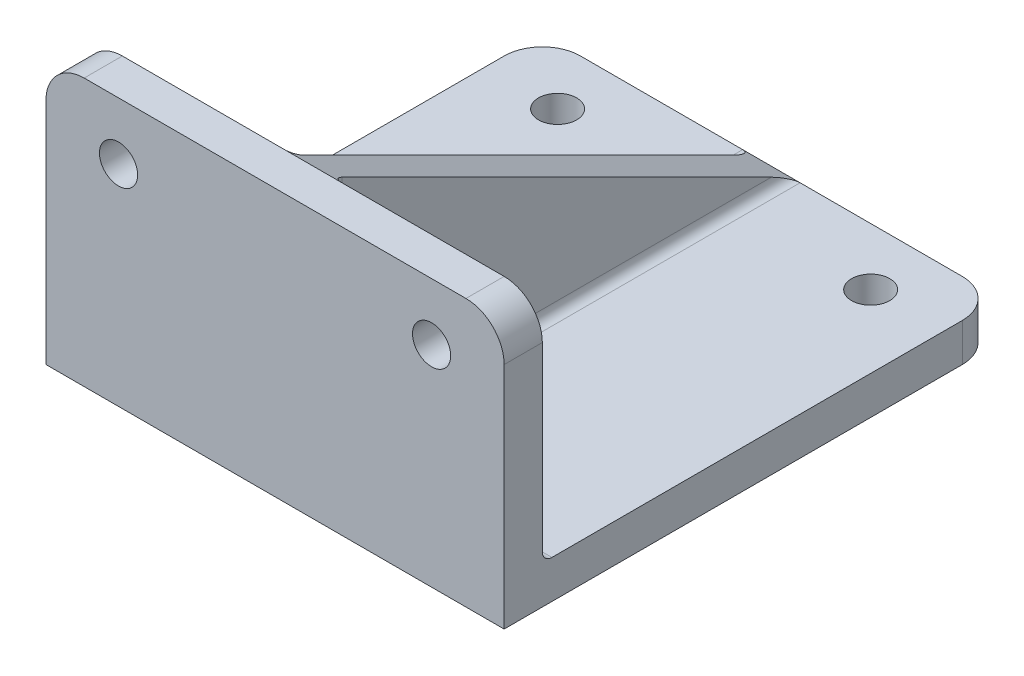
ISO-10303-21;
HEADER;
FILE_DESCRIPTION(('STEP AP214'),'2;1');
FILE_NAME('part.step','',(''),(''),'','','');
FILE_SCHEMA(('AUTOMOTIVE_DESIGN { 1 0 10303 214 1 1 1 1 }'));
ENDSEC;
DATA;
#1=APPLICATION_CONTEXT('core data for automotive mechanical design processes');
#2=APPLICATION_PROTOCOL_DEFINITION('international standard','automotive_design',2000,#1);
#3=PRODUCT_CONTEXT('',#1,'mechanical');
#4=PRODUCT('Part','Part','',(#3));
#5=PRODUCT_RELATED_PRODUCT_CATEGORY('part','',(#4));
#6=PRODUCT_DEFINITION_FORMATION('','',#4);
#7=PRODUCT_DEFINITION_CONTEXT('part definition',#1,'design');
#8=PRODUCT_DEFINITION('design','',#6,#7);
#9=PRODUCT_DEFINITION_SHAPE('','',#8);
#10=(LENGTH_UNIT() NAMED_UNIT(*) SI_UNIT(.MILLI.,.METRE.));
#11=(NAMED_UNIT(*) PLANE_ANGLE_UNIT() SI_UNIT($,.RADIAN.));
#12=(NAMED_UNIT(*) SI_UNIT($,.STERADIAN.) SOLID_ANGLE_UNIT());
#13=UNCERTAINTY_MEASURE_WITH_UNIT(LENGTH_MEASURE(1.E-05),#10,'distance_accuracy_value','');
#14=(GEOMETRIC_REPRESENTATION_CONTEXT(3) GLOBAL_UNCERTAINTY_ASSIGNED_CONTEXT((#13)) GLOBAL_UNIT_ASSIGNED_CONTEXT((#10,
#11,#12)) REPRESENTATION_CONTEXT('',''));
#15=CARTESIAN_POINT('',(0.,0.,0.));
#16=DIRECTION('',(0.,0.,1.));
#17=DIRECTION('',(1.,0.,0.));
#18=AXIS2_PLACEMENT_3D('',#15,#16,#17);
#19=CARTESIAN_POINT('',(76.2,0.,0.));
#20=DIRECTION('',(0.,0.,1.));
#21=DIRECTION('',(1.,0.,0.));
#22=AXIS2_PLACEMENT_3D('',#19,#20,#21);
#23=PLANE('',#22);
#24=CARTESIAN_POINT('',(12.065,28.575,0.));
#25=DIRECTION('',(0.,0.,1.));
#26=DIRECTION('',(1.,0.,0.));
#27=AXIS2_PLACEMENT_3D('',#24,#25,#26);
#28=CIRCLE('',#27,3.175);
#29=CARTESIAN_POINT('',(8.89,28.575,0.));
#30=VERTEX_POINT('',#29);
#31=EDGE_CURVE('E249',#30,#30,#28,.T.);
#32=ORIENTED_EDGE('',*,*,#31,.T.);
#33=EDGE_LOOP('',(#32));
#34=FACE_BOUND('',#33,.T.);
#35=DIRECTION('',(0.,-1.,0.));
#36=VECTOR('',#35,1.);
#37=CARTESIAN_POINT('',(33.3248,0.,0.));
#38=LINE('',#37,#36);
#39=CARTESIAN_POINT('',(33.3248,38.1,0.));
#40=VERTEX_POINT('',#39);
#41=CARTESIAN_POINT('',(33.3248,1.6002,0.));
#42=VERTEX_POINT('',#41);
#43=EDGE_CURVE('E85',#40,#42,#38,.T.);
#44=ORIENTED_EDGE('',*,*,#43,.T.);
#45=DIRECTION('',(-1.,0.,0.));
#46=VECTOR('',#45,1.);
#47=CARTESIAN_POINT('',(0.,1.6002,0.));
#48=LINE('',#47,#46);
#49=CARTESIAN_POINT('',(0.,1.6002,0.));
#50=VERTEX_POINT('',#49);
#51=EDGE_CURVE('E151',#42,#50,#48,.T.);
#52=ORIENTED_EDGE('',*,*,#51,.T.);
#53=DIRECTION('',(0.,1.,0.));
#54=VECTOR('',#53,1.);
#55=CARTESIAN_POINT('',(0.,0.,0.));
#56=LINE('',#55,#54);
#57=CARTESIAN_POINT('',(0.,31.75,0.));
#58=VERTEX_POINT('',#57);
#59=EDGE_CURVE('E248',#50,#58,#56,.T.);
#60=ORIENTED_EDGE('',*,*,#59,.T.);
#61=CARTESIAN_POINT('',(6.35,31.75,0.));
#62=DIRECTION('',(0.,0.,1.));
#63=DIRECTION('',(1.,0.,0.));
#64=AXIS2_PLACEMENT_3D('',#61,#62,#63);
#65=CIRCLE('',#64,6.35);
#66=CARTESIAN_POINT('',(6.35000000000002,38.1,0.));
#67=VERTEX_POINT('',#66);
#68=EDGE_CURVE('E207',#58,#67,#65,.F.);
#69=ORIENTED_EDGE('',*,*,#68,.T.);
#70=DIRECTION('',(-1.,0.,0.));
#71=VECTOR('',#70,1.);
#72=CARTESIAN_POINT('',(76.2,38.1,0.));
#73=LINE('',#72,#71);
#74=EDGE_CURVE('E196',#40,#67,#73,.T.);
#75=ORIENTED_EDGE('',*,*,#74,.F.);
#76=EDGE_LOOP('',(#44,#52,#60,#69,#75));
#77=FACE_BOUND('',#76,.T.);
#78=ADVANCED_FACE('F33',(#34,#77),#23,.F.);
#79=CARTESIAN_POINT('',(64.135,28.575,0.));
#80=DIRECTION('',(0.,0.,1.));
#81=DIRECTION('',(-1.,0.,0.));
#82=AXIS2_PLACEMENT_3D('',#79,#80,#81);
#83=CIRCLE('',#82,3.175);
#84=CARTESIAN_POINT('',(60.96,28.575,0.));
#85=VERTEX_POINT('',#84);
#86=EDGE_CURVE('E253',#85,#85,#83,.T.);
#87=ORIENTED_EDGE('',*,*,#86,.T.);
#88=EDGE_LOOP('',(#87));
#89=FACE_BOUND('',#88,.T.);
#90=DIRECTION('',(0.,1.,0.));
#91=VECTOR('',#90,1.);
#92=CARTESIAN_POINT('',(76.2,0.,0.));
#93=LINE('',#92,#91);
#94=CARTESIAN_POINT('',(76.2,1.6002,0.));
#95=VERTEX_POINT('',#94);
#96=CARTESIAN_POINT('',(76.2,31.75,0.));
#97=VERTEX_POINT('',#96);
#98=EDGE_CURVE('E173',#95,#97,#93,.T.);
#99=ORIENTED_EDGE('',*,*,#98,.F.);
#100=DIRECTION('',(-1.,0.,0.));
#101=VECTOR('',#100,1.);
#102=CARTESIAN_POINT('',(41.275,1.6002,0.));
#103=LINE('',#102,#101);
#104=CARTESIAN_POINT('',(42.8752,1.6002,0.));
#105=VERTEX_POINT('',#104);
#106=EDGE_CURVE('E256',#95,#105,#103,.T.);
#107=ORIENTED_EDGE('',*,*,#106,.T.);
#108=DIRECTION('',(0.,1.,0.));
#109=VECTOR('',#108,1.);
#110=CARTESIAN_POINT('',(42.8752,38.1,0.));
#111=LINE('',#110,#109);
#112=CARTESIAN_POINT('',(42.8752,38.1,0.));
#113=VERTEX_POINT('',#112);
#114=EDGE_CURVE('E244',#105,#113,#111,.T.);
#115=ORIENTED_EDGE('',*,*,#114,.T.);
#116=CARTESIAN_POINT('',(69.85,38.1,0.));
#117=VERTEX_POINT('',#116);
#118=EDGE_CURVE('E197',#117,#113,#73,.T.);
#119=ORIENTED_EDGE('',*,*,#118,.F.);
#120=CARTESIAN_POINT('',(69.85,31.75,0.));
#121=DIRECTION('',(0.,0.,1.));
#122=DIRECTION('',(1.,0.,0.));
#123=AXIS2_PLACEMENT_3D('',#120,#121,#122);
#124=CIRCLE('',#123,6.35);
#125=EDGE_CURVE('E204',#117,#97,#124,.F.);
#126=ORIENTED_EDGE('',*,*,#125,.T.);
#127=EDGE_LOOP('',(#99,#107,#115,#119,#126));
#128=FACE_BOUND('',#127,.T.);
#129=ADVANCED_FACE('F377',(#89,#128),#23,.F.);
#130=CARTESIAN_POINT('',(76.2,0.,-76.2));
#131=DIRECTION('',(0.,-1.,0.));
#132=DIRECTION('',(0.,0.,-1.));
#133=AXIS2_PLACEMENT_3D('',#130,#131,#132);
#134=PLANE('',#133);
#135=CARTESIAN_POINT('',(12.065,0.,-66.675));
#136=DIRECTION('',(0.,1.,0.));
#137=DIRECTION('',(0.,0.,1.));
#138=AXIS2_PLACEMENT_3D('',#135,#136,#137);
#139=CIRCLE('',#138,3.175);
#140=CARTESIAN_POINT('',(12.065,0.,-63.5));
#141=VERTEX_POINT('',#140);
#142=EDGE_CURVE('E632',#141,#141,#139,.T.);
#143=ORIENTED_EDGE('',*,*,#142,.F.);
#144=EDGE_LOOP('',(#143));
#145=FACE_BOUND('',#144,.T.);
#146=DIRECTION('',(0.,0.,1.));
#147=VECTOR('',#146,1.);
#148=CARTESIAN_POINT('',(0.,0.,-76.2));
#149=LINE('',#148,#147);
#150=CARTESIAN_POINT('',(0.,0.,-69.85));
#151=VERTEX_POINT('',#150);
#152=CARTESIAN_POINT('',(0.,0.,-1.60020000000002));
#153=VERTEX_POINT('',#152);
#154=EDGE_CURVE('E166',#151,#153,#149,.T.);
#155=ORIENTED_EDGE('',*,*,#154,.T.);
#156=DIRECTION('',(-1.,0.,0.));
#157=VECTOR('',#156,1.);
#158=CARTESIAN_POINT('',(34.925,0.,-1.6002));
#159=LINE('',#158,#157);
#160=CARTESIAN_POINT('',(33.3248,0.,-1.6002));
#161=VERTEX_POINT('',#160);
#162=EDGE_CURVE('E123',#153,#161,#159,.F.);
#163=ORIENTED_EDGE('',*,*,#162,.T.);
#164=DIRECTION('',(0.,0.,-1.));
#165=VECTOR('',#164,1.);
#166=CARTESIAN_POINT('',(33.3248,0.,-76.2));
#167=LINE('',#166,#165);
#168=CARTESIAN_POINT('',(33.3248,0.,-76.2));
#169=VERTEX_POINT('',#168);
#170=EDGE_CURVE('E154',#161,#169,#167,.T.);
#171=ORIENTED_EDGE('',*,*,#170,.T.);
#172=DIRECTION('',(-1.,0.,0.));
#173=VECTOR('',#172,1.);
#174=CARTESIAN_POINT('',(76.2,0.,-76.2));
#175=LINE('',#174,#173);
#176=CARTESIAN_POINT('',(6.35000000000002,0.,-76.2));
#177=VERTEX_POINT('',#176);
#178=EDGE_CURVE('E187',#169,#177,#175,.T.);
#179=ORIENTED_EDGE('',*,*,#178,.T.);
#180=CARTESIAN_POINT('',(6.35,0.,-69.85));
#181=DIRECTION('',(0.,-1.,0.));
#182=DIRECTION('',(0.,0.,-1.));
#183=AXIS2_PLACEMENT_3D('',#180,#181,#182);
#184=CIRCLE('',#183,6.35);
#185=EDGE_CURVE('E169',#177,#151,#184,.F.);
#186=ORIENTED_EDGE('',*,*,#185,.T.);
#187=EDGE_LOOP('',(#155,#163,#171,#179,#186));
#188=FACE_BOUND('',#187,.T.);
#189=ADVANCED_FACE('F162',(#145,#188),#134,.F.);
#190=CARTESIAN_POINT('',(64.135,0.,-66.675));
#191=DIRECTION('',(0.,1.,0.));
#192=DIRECTION('',(0.,0.,-1.));
#193=AXIS2_PLACEMENT_3D('',#190,#191,#192);
#194=CIRCLE('',#193,3.175);
#195=CARTESIAN_POINT('',(64.135,0.,-69.85));
#196=VERTEX_POINT('',#195);
#197=EDGE_CURVE('E638',#196,#196,#194,.T.);
#198=ORIENTED_EDGE('',*,*,#197,.F.);
#199=EDGE_LOOP('',(#198));
#200=FACE_BOUND('',#199,.T.);
#201=DIRECTION('',(0.,0.,1.));
#202=VECTOR('',#201,1.);
#203=CARTESIAN_POINT('',(42.8752,0.,0.));
#204=LINE('',#203,#202);
#205=CARTESIAN_POINT('',(42.8752,0.,-76.2));
#206=VERTEX_POINT('',#205);
#207=CARTESIAN_POINT('',(42.8752,0.,-1.6002));
#208=VERTEX_POINT('',#207);
#209=EDGE_CURVE('E259',#206,#208,#204,.T.);
#210=ORIENTED_EDGE('',*,*,#209,.T.);
#211=DIRECTION('',(-1.,0.,0.));
#212=VECTOR('',#211,1.);
#213=CARTESIAN_POINT('',(76.2,0.,-1.6002));
#214=LINE('',#213,#212);
#215=CARTESIAN_POINT('',(76.2,0.,-1.60020000000002));
#216=VERTEX_POINT('',#215);
#217=EDGE_CURVE('E262',#208,#216,#214,.F.);
#218=ORIENTED_EDGE('',*,*,#217,.T.);
#219=DIRECTION('',(0.,0.,1.));
#220=VECTOR('',#219,1.);
#221=CARTESIAN_POINT('',(76.2,0.,-76.2));
#222=LINE('',#221,#220);
#223=CARTESIAN_POINT('',(76.2,0.,-69.85));
#224=VERTEX_POINT('',#223);
#225=EDGE_CURVE('E346',#224,#216,#222,.T.);
#226=ORIENTED_EDGE('',*,*,#225,.F.);
#227=CARTESIAN_POINT('',(69.85,0.,-69.85));
#228=DIRECTION('',(0.,-1.,0.));
#229=DIRECTION('',(0.,0.,-1.));
#230=AXIS2_PLACEMENT_3D('',#227,#228,#229);
#231=CIRCLE('',#230,6.35);
#232=CARTESIAN_POINT('',(69.85,0.,-76.2));
#233=VERTEX_POINT('',#232);
#234=EDGE_CURVE('E240',#224,#233,#231,.F.);
#235=ORIENTED_EDGE('',*,*,#234,.T.);
#236=EDGE_CURVE('E184',#233,#206,#175,.T.);
#237=ORIENTED_EDGE('',*,*,#236,.T.);
#238=EDGE_LOOP('',(#210,#218,#226,#235,#237));
#239=FACE_BOUND('',#238,.T.);
#240=ADVANCED_FACE('F287',(#200,#239),#134,.F.);
#241=CARTESIAN_POINT('',(76.2,0.,6.35));
#242=DIRECTION('',(0.,0.,1.));
#243=DIRECTION('',(1.,0.,0.));
#244=AXIS2_PLACEMENT_3D('',#241,#242,#243);
#245=PLANE('',#244);
#246=CARTESIAN_POINT('',(12.065,28.575,6.35000000000001));
#247=DIRECTION('',(0.,0.,1.));
#248=DIRECTION('',(1.,0.,0.));
#249=AXIS2_PLACEMENT_3D('',#246,#247,#248);
#250=CIRCLE('',#249,3.175);
#251=CARTESIAN_POINT('',(8.89,28.575,6.34999999999999));
#252=VERTEX_POINT('',#251);
#253=EDGE_CURVE('E245',#252,#252,#250,.F.);
#254=ORIENTED_EDGE('',*,*,#253,.T.);
#255=EDGE_LOOP('',(#254));
#256=FACE_BOUND('',#255,.T.);
#257=DIRECTION('',(-1.,0.,0.));
#258=VECTOR('',#257,1.);
#259=CARTESIAN_POINT('',(76.2,38.1,6.35));
#260=LINE('',#259,#258);
#261=CARTESIAN_POINT('',(69.85,38.1,6.35));
#262=VERTEX_POINT('',#261);
#263=CARTESIAN_POINT('',(6.35000000000002,38.1,6.35));
#264=VERTEX_POINT('',#263);
#265=EDGE_CURVE('E193',#262,#264,#260,.T.);
#266=ORIENTED_EDGE('',*,*,#265,.T.);
#267=CARTESIAN_POINT('',(6.35,31.75,6.35));
#268=DIRECTION('',(0.,0.,1.));
#269=DIRECTION('',(1.,0.,0.));
#270=AXIS2_PLACEMENT_3D('',#267,#268,#269);
#271=CIRCLE('',#270,6.35);
#272=CARTESIAN_POINT('',(0.,31.75,6.35));
#273=VERTEX_POINT('',#272);
#274=EDGE_CURVE('E219',#264,#273,#271,.T.);
#275=ORIENTED_EDGE('',*,*,#274,.T.);
#276=DIRECTION('',(0.,1.,0.));
#277=VECTOR('',#276,1.);
#278=CARTESIAN_POINT('',(0.,0.,6.35));
#279=LINE('',#278,#277);
#280=CARTESIAN_POINT('',(0.,-6.35,6.35));
#281=VERTEX_POINT('',#280);
#282=EDGE_CURVE('E180',#281,#273,#279,.T.);
#283=ORIENTED_EDGE('',*,*,#282,.F.);
#284=DIRECTION('',(-1.,0.,0.));
#285=VECTOR('',#284,1.);
#286=CARTESIAN_POINT('',(76.2,-6.35,6.35));
#287=LINE('',#286,#285);
#288=CARTESIAN_POINT('',(76.2,-6.35,6.35));
#289=VERTEX_POINT('',#288);
#290=EDGE_CURVE('E190',#289,#281,#287,.T.);
#291=ORIENTED_EDGE('',*,*,#290,.F.);
#292=DIRECTION('',(0.,1.,0.));
#293=VECTOR('',#292,1.);
#294=CARTESIAN_POINT('',(76.2,0.,6.35));
#295=LINE('',#294,#293);
#296=CARTESIAN_POINT('',(76.2,31.75,6.35));
#297=VERTEX_POINT('',#296);
#298=EDGE_CURVE('E177',#289,#297,#295,.T.);
#299=ORIENTED_EDGE('',*,*,#298,.T.);
#300=CARTESIAN_POINT('',(69.85,31.75,6.35));
#301=DIRECTION('',(0.,0.,1.));
#302=DIRECTION('',(1.,0.,0.));
#303=AXIS2_PLACEMENT_3D('',#300,#301,#302);
#304=CIRCLE('',#303,6.35);
#305=EDGE_CURVE('E216',#297,#262,#304,.T.);
#306=ORIENTED_EDGE('',*,*,#305,.T.);
#307=EDGE_LOOP('',(#266,#275,#283,#291,#299,#306));
#308=FACE_BOUND('',#307,.T.);
#309=CARTESIAN_POINT('',(64.135,28.575,6.35000000000001));
#310=DIRECTION('',(0.,0.,1.));
#311=DIRECTION('',(1.,0.,0.));
#312=AXIS2_PLACEMENT_3D('',#309,#310,#311);
#313=CIRCLE('',#312,3.175);
#314=CARTESIAN_POINT('',(60.96,28.575,6.34999999999999));
#315=VERTEX_POINT('',#314);
#316=EDGE_CURVE('E250',#315,#315,#313,.F.);
#317=ORIENTED_EDGE('',*,*,#316,.T.);
#318=EDGE_LOOP('',(#317));
#319=FACE_BOUND('',#318,.T.);
#320=ADVANCED_FACE('F350',(#256,#308,#319),#245,.T.);
#321=CARTESIAN_POINT('',(76.2,38.1,6.35));
#322=DIRECTION('',(0.,1.,0.));
#323=DIRECTION('',(0.,0.,1.));
#324=AXIS2_PLACEMENT_3D('',#321,#322,#323);
#325=PLANE('',#324);
#326=ORIENTED_EDGE('',*,*,#118,.T.);
#327=DIRECTION('',(-1.,0.,0.));
#328=VECTOR('',#327,1.);
#329=CARTESIAN_POINT('',(34.925,38.1,0.));
#330=LINE('',#329,#328);
#331=EDGE_CURVE('E50',#113,#40,#330,.T.);
#332=ORIENTED_EDGE('',*,*,#331,.T.);
#333=ORIENTED_EDGE('',*,*,#74,.T.);
#334=DIRECTION('',(0.,0.,-1.));
#335=VECTOR('',#334,1.);
#336=CARTESIAN_POINT('',(6.34999999999999,38.1,6.35));
#337=LINE('',#336,#335);
#338=EDGE_CURVE('E213',#67,#264,#337,.F.);
#339=ORIENTED_EDGE('',*,*,#338,.T.);
#340=ORIENTED_EDGE('',*,*,#265,.F.);
#341=DIRECTION('',(0.,0.,-1.));
#342=VECTOR('',#341,1.);
#343=CARTESIAN_POINT('',(69.85,38.1,0.));
#344=LINE('',#343,#342);
#345=EDGE_CURVE('E210',#262,#117,#344,.T.);
#346=ORIENTED_EDGE('',*,*,#345,.T.);
#347=EDGE_LOOP('',(#326,#332,#333,#339,#340,#346));
#348=FACE_BOUND('',#347,.T.);
#349=ADVANCED_FACE('F387',(#348),#325,.T.);
#350=CARTESIAN_POINT('',(76.2,-6.35,-76.2));
#351=DIRECTION('',(0.,-1.,0.));
#352=DIRECTION('',(0.,0.,-1.));
#353=AXIS2_PLACEMENT_3D('',#350,#351,#352);
#354=PLANE('',#353);
#355=CARTESIAN_POINT('',(64.135,-6.35,-66.675));
#356=DIRECTION('',(0.,1.,0.));
#357=DIRECTION('',(0.,0.,-1.));
#358=AXIS2_PLACEMENT_3D('',#355,#356,#357);
#359=CIRCLE('',#358,3.175);
#360=CARTESIAN_POINT('',(64.135,-6.35,-69.85));
#361=VERTEX_POINT('',#360);
#362=EDGE_CURVE('E635',#361,#361,#359,.T.);
#363=ORIENTED_EDGE('',*,*,#362,.T.);
#364=EDGE_LOOP('',(#363));
#365=FACE_BOUND('',#364,.T.);
#366=CARTESIAN_POINT('',(12.065,-6.35,-66.675));
#367=DIRECTION('',(0.,1.,0.));
#368=DIRECTION('',(0.,0.,1.));
#369=AXIS2_PLACEMENT_3D('',#366,#367,#368);
#370=CIRCLE('',#369,3.175);
#371=CARTESIAN_POINT('',(12.065,-6.35,-63.5));
#372=VERTEX_POINT('',#371);
#373=EDGE_CURVE('E631',#372,#372,#370,.T.);
#374=ORIENTED_EDGE('',*,*,#373,.T.);
#375=EDGE_LOOP('',(#374));
#376=FACE_BOUND('',#375,.T.);
#377=DIRECTION('',(0.,0.,1.));
#378=VECTOR('',#377,1.);
#379=CARTESIAN_POINT('',(0.,-6.35,-76.2));
#380=LINE('',#379,#378);
#381=CARTESIAN_POINT('',(0.,-6.35,-69.85));
#382=VERTEX_POINT('',#381);
#383=EDGE_CURVE('E174',#382,#281,#380,.T.);
#384=ORIENTED_EDGE('',*,*,#383,.F.);
#385=CARTESIAN_POINT('',(6.35,-6.35,-69.85));
#386=DIRECTION('',(0.,-1.,0.));
#387=DIRECTION('',(0.,0.,-1.));
#388=AXIS2_PLACEMENT_3D('',#385,#386,#387);
#389=CIRCLE('',#388,6.35);
#390=CARTESIAN_POINT('',(6.35000000000002,-6.35,-76.2));
#391=VERTEX_POINT('',#390);
#392=EDGE_CURVE('E231',#382,#391,#389,.T.);
#393=ORIENTED_EDGE('',*,*,#392,.T.);
#394=DIRECTION('',(-1.,0.,0.));
#395=VECTOR('',#394,1.);
#396=CARTESIAN_POINT('',(76.2,-6.35,-76.2));
#397=LINE('',#396,#395);
#398=CARTESIAN_POINT('',(69.85,-6.35,-76.2));
#399=VERTEX_POINT('',#398);
#400=EDGE_CURVE('E186',#399,#391,#397,.T.);
#401=ORIENTED_EDGE('',*,*,#400,.F.);
#402=CARTESIAN_POINT('',(69.85,-6.35,-69.85));
#403=DIRECTION('',(0.,-1.,0.));
#404=DIRECTION('',(0.,0.,-1.));
#405=AXIS2_PLACEMENT_3D('',#402,#403,#404);
#406=CIRCLE('',#405,6.35);
#407=CARTESIAN_POINT('',(76.2,-6.35,-69.85));
#408=VERTEX_POINT('',#407);
#409=EDGE_CURVE('E228',#399,#408,#406,.T.);
#410=ORIENTED_EDGE('',*,*,#409,.T.);
#411=DIRECTION('',(0.,0.,1.));
#412=VECTOR('',#411,1.);
#413=CARTESIAN_POINT('',(76.2,-6.35,-76.2));
#414=LINE('',#413,#412);
#415=EDGE_CURVE('E337',#408,#289,#414,.T.);
#416=ORIENTED_EDGE('',*,*,#415,.T.);
#417=ORIENTED_EDGE('',*,*,#290,.T.);
#418=EDGE_LOOP('',(#384,#393,#401,#410,#416,#417));
#419=FACE_BOUND('',#418,.T.);
#420=ADVANCED_FACE('F340',(#365,#376,#419),#354,.T.);
#421=CARTESIAN_POINT('',(76.2,0.,-76.2));
#422=DIRECTION('',(0.,0.,-1.));
#423=DIRECTION('',(-1.,0.,0.));
#424=AXIS2_PLACEMENT_3D('',#421,#422,#423);
#425=PLANE('',#424);
#426=ORIENTED_EDGE('',*,*,#400,.T.);
#427=DIRECTION('',(0.,-1.,0.));
#428=VECTOR('',#427,1.);
#429=CARTESIAN_POINT('',(6.34999999999999,0.,-76.2));
#430=LINE('',#429,#428);
#431=EDGE_CURVE('E237',#391,#177,#430,.F.);
#432=ORIENTED_EDGE('',*,*,#431,.T.);
#433=ORIENTED_EDGE('',*,*,#178,.F.);
#434=DIRECTION('',(1.,0.,0.));
#435=VECTOR('',#434,1.);
#436=CARTESIAN_POINT('',(34.925,0.,-76.2));
#437=LINE('',#436,#435);
#438=EDGE_CURVE('E59',#169,#206,#437,.T.);
#439=ORIENTED_EDGE('',*,*,#438,.T.);
#440=ORIENTED_EDGE('',*,*,#236,.F.);
#441=DIRECTION('',(0.,-1.,0.));
#442=VECTOR('',#441,1.);
#443=CARTESIAN_POINT('',(69.85,-6.35,-76.2));
#444=LINE('',#443,#442);
#445=EDGE_CURVE('E234',#233,#399,#444,.T.);
#446=ORIENTED_EDGE('',*,*,#445,.T.);
#447=EDGE_LOOP('',(#426,#432,#433,#439,#440,#446));
#448=FACE_BOUND('',#447,.T.);
#449=ADVANCED_FACE('F503',(#448),#425,.T.);
#450=CARTESIAN_POINT('',(76.2,38.1,0.));
#451=DIRECTION('',(-1.,0.,0.));
#452=DIRECTION('',(0.,0.,1.));
#453=AXIS2_PLACEMENT_3D('',#450,#451,#452);
#454=PLANE('',#453);
#455=ORIENTED_EDGE('',*,*,#225,.T.);
#456=CARTESIAN_POINT('',(76.2,1.6002,-1.6002));
#457=DIRECTION('',(-1.,0.,0.));
#458=DIRECTION('',(0.,0.,1.));
#459=AXIS2_PLACEMENT_3D('',#456,#457,#458);
#460=CIRCLE('',#459,1.6002);
#461=EDGE_CURVE('E118',#216,#95,#460,.T.);
#462=ORIENTED_EDGE('',*,*,#461,.T.);
#463=ORIENTED_EDGE('',*,*,#98,.T.);
#464=DIRECTION('',(0.,0.,-1.));
#465=VECTOR('',#464,1.);
#466=CARTESIAN_POINT('',(76.2,31.75,6.35));
#467=LINE('',#466,#465);
#468=EDGE_CURVE('E225',#97,#297,#467,.F.);
#469=ORIENTED_EDGE('',*,*,#468,.T.);
#470=ORIENTED_EDGE('',*,*,#298,.F.);
#471=ORIENTED_EDGE('',*,*,#415,.F.);
#472=DIRECTION('',(0.,-1.,0.));
#473=VECTOR('',#472,1.);
#474=CARTESIAN_POINT('',(76.2,0.,-69.85));
#475=LINE('',#474,#473);
#476=EDGE_CURVE('E222',#408,#224,#475,.F.);
#477=ORIENTED_EDGE('',*,*,#476,.T.);
#478=EDGE_LOOP('',(#455,#462,#463,#469,#470,#471,#477));
#479=FACE_BOUND('',#478,.T.);
#480=ADVANCED_FACE('F354',(#479),#454,.F.);
#481=CARTESIAN_POINT('',(0.,38.1,0.));
#482=DIRECTION('',(-1.,0.,0.));
#483=DIRECTION('',(0.,0.,1.));
#484=AXIS2_PLACEMENT_3D('',#481,#482,#483);
#485=PLANE('',#484);
#486=ORIENTED_EDGE('',*,*,#282,.T.);
#487=DIRECTION('',(0.,0.,-1.));
#488=VECTOR('',#487,1.);
#489=CARTESIAN_POINT('',(0.,31.75,0.));
#490=LINE('',#489,#488);
#491=EDGE_CURVE('E201',#273,#58,#490,.T.);
#492=ORIENTED_EDGE('',*,*,#491,.T.);
#493=ORIENTED_EDGE('',*,*,#59,.F.);
#494=CARTESIAN_POINT('',(0.,1.6002,-1.6002));
#495=DIRECTION('',(-1.,0.,0.));
#496=DIRECTION('',(0.,0.,1.));
#497=AXIS2_PLACEMENT_3D('',#494,#495,#496);
#498=CIRCLE('',#497,1.6002);
#499=EDGE_CURVE('E106',#50,#153,#498,.F.);
#500=ORIENTED_EDGE('',*,*,#499,.T.);
#501=ORIENTED_EDGE('',*,*,#154,.F.);
#502=DIRECTION('',(0.,-1.,0.));
#503=VECTOR('',#502,1.);
#504=CARTESIAN_POINT('',(0.,38.1,-69.85));
#505=LINE('',#504,#503);
#506=EDGE_CURVE('E199',#151,#382,#505,.T.);
#507=ORIENTED_EDGE('',*,*,#506,.T.);
#508=ORIENTED_EDGE('',*,*,#383,.T.);
#509=EDGE_LOOP('',(#486,#492,#493,#500,#501,#507,#508));
#510=FACE_BOUND('',#509,.T.);
#511=ADVANCED_FACE('F361',(#510),#485,.T.);
#512=CARTESIAN_POINT('',(6.35,31.75,0.));
#513=DIRECTION('',(0.,0.,-1.));
#514=DIRECTION('',(-1.,0.,0.));
#515=AXIS2_PLACEMENT_3D('',#512,#513,#514);
#516=CYLINDRICAL_SURFACE('',#515,6.35);
#517=ORIENTED_EDGE('',*,*,#274,.F.);
#518=ORIENTED_EDGE('',*,*,#338,.F.);
#519=ORIENTED_EDGE('',*,*,#68,.F.);
#520=ORIENTED_EDGE('',*,*,#491,.F.);
#521=EDGE_LOOP('',(#517,#518,#519,#520));
#522=FACE_BOUND('',#521,.T.);
#523=ADVANCED_FACE('F365',(#522),#516,.T.);
#524=CARTESIAN_POINT('',(69.85,31.75,6.35));
#525=DIRECTION('',(0.,0.,1.));
#526=DIRECTION('',(1.,0.,0.));
#527=AXIS2_PLACEMENT_3D('',#524,#525,#526);
#528=CYLINDRICAL_SURFACE('',#527,6.35);
#529=ORIENTED_EDGE('',*,*,#305,.F.);
#530=ORIENTED_EDGE('',*,*,#468,.F.);
#531=ORIENTED_EDGE('',*,*,#125,.F.);
#532=ORIENTED_EDGE('',*,*,#345,.F.);
#533=EDGE_LOOP('',(#529,#530,#531,#532));
#534=FACE_BOUND('',#533,.T.);
#535=ADVANCED_FACE('F391',(#534),#528,.T.);
#536=CARTESIAN_POINT('',(6.35,38.1,-69.85));
#537=DIRECTION('',(0.,-1.,0.));
#538=DIRECTION('',(0.,0.,-1.));
#539=AXIS2_PLACEMENT_3D('',#536,#537,#538);
#540=CYLINDRICAL_SURFACE('',#539,6.35);
#541=ORIENTED_EDGE('',*,*,#185,.F.);
#542=ORIENTED_EDGE('',*,*,#431,.F.);
#543=ORIENTED_EDGE('',*,*,#392,.F.);
#544=ORIENTED_EDGE('',*,*,#506,.F.);
#545=EDGE_LOOP('',(#541,#542,#543,#544));
#546=FACE_BOUND('',#545,.T.);
#547=ADVANCED_FACE('F394',(#546),#540,.T.);
#548=CARTESIAN_POINT('',(69.85,0.,-69.85));
#549=DIRECTION('',(0.,1.,0.));
#550=DIRECTION('',(0.,0.,1.));
#551=AXIS2_PLACEMENT_3D('',#548,#549,#550);
#552=CYLINDRICAL_SURFACE('',#551,6.35);
#553=ORIENTED_EDGE('',*,*,#234,.F.);
#554=ORIENTED_EDGE('',*,*,#476,.F.);
#555=ORIENTED_EDGE('',*,*,#409,.F.);
#556=ORIENTED_EDGE('',*,*,#445,.F.);
#557=EDGE_LOOP('',(#553,#554,#555,#556));
#558=FACE_BOUND('',#557,.T.);
#559=ADVANCED_FACE('F398',(#558),#552,.T.);
#560=CARTESIAN_POINT('',(12.065,28.575,76.2));
#561=DIRECTION('',(0.,0.,-1.));
#562=DIRECTION('',(-1.,0.,0.));
#563=AXIS2_PLACEMENT_3D('',#560,#561,#562);
#564=CYLINDRICAL_SURFACE('',#563,3.175);
#565=CARTESIAN_POINT('',(8.89,28.575,6.34999999999999));
#566=CARTESIAN_POINT('',(8.89,28.575,6.28385416666666));
#567=CARTESIAN_POINT('',(8.89,28.575,6.21770833333333));
#568=CARTESIAN_POINT('',(8.89,28.575,6.08541666666666));
#569=CARTESIAN_POINT('',(8.89,28.575,6.01927083333333));
#570=CARTESIAN_POINT('',(8.89,28.575,5.88697916666666));
#571=CARTESIAN_POINT('',(8.89,28.575,5.82083333333333));
#572=CARTESIAN_POINT('',(8.89,28.575,5.68854166666666));
#573=CARTESIAN_POINT('',(8.89,28.575,5.62239583333333));
#574=CARTESIAN_POINT('',(8.89,28.575,5.49010416666666));
#575=CARTESIAN_POINT('',(8.89,28.575,5.42395833333333));
#576=CARTESIAN_POINT('',(8.89,28.575,5.29166666666666));
#577=CARTESIAN_POINT('',(8.89,28.575,5.22552083333333));
#578=CARTESIAN_POINT('',(8.89,28.575,5.09322916666666));
#579=CARTESIAN_POINT('',(8.89,28.575,5.02708333333333));
#580=CARTESIAN_POINT('',(8.89,28.575,4.89479166666667));
#581=CARTESIAN_POINT('',(8.89,28.575,4.82864583333333));
#582=CARTESIAN_POINT('',(8.89,28.575,4.69635416666667));
#583=CARTESIAN_POINT('',(8.89,28.575,4.63020833333333));
#584=CARTESIAN_POINT('',(8.89,28.575,4.49791666666666));
#585=CARTESIAN_POINT('',(8.89,28.575,4.43177083333333));
#586=CARTESIAN_POINT('',(8.89,28.575,4.29947916666667));
#587=CARTESIAN_POINT('',(8.89,28.575,4.23333333333333));
#588=CARTESIAN_POINT('',(8.89,28.575,4.10104166666667));
#589=CARTESIAN_POINT('',(8.89,28.575,4.03489583333333));
#590=CARTESIAN_POINT('',(8.89,28.575,3.90260416666666));
#591=CARTESIAN_POINT('',(8.89,28.575,3.83645833333333));
#592=CARTESIAN_POINT('',(8.89,28.575,3.70416666666667));
#593=CARTESIAN_POINT('',(8.89,28.575,3.63802083333333));
#594=CARTESIAN_POINT('',(8.89,28.575,3.50572916666667));
#595=CARTESIAN_POINT('',(8.89,28.575,3.43958333333333));
#596=CARTESIAN_POINT('',(8.89,28.575,3.30729166666666));
#597=CARTESIAN_POINT('',(8.89,28.575,3.24114583333333));
#598=CARTESIAN_POINT('',(8.89,28.575,3.10885416666667));
#599=CARTESIAN_POINT('',(8.89,28.575,3.04270833333333));
#600=CARTESIAN_POINT('',(8.89,28.575,2.91041666666667));
#601=CARTESIAN_POINT('',(8.89,28.575,2.84427083333333));
#602=CARTESIAN_POINT('',(8.89,28.575,2.71197916666666));
#603=CARTESIAN_POINT('',(8.89,28.575,2.64583333333333));
#604=CARTESIAN_POINT('',(8.89,28.575,2.51354166666667));
#605=CARTESIAN_POINT('',(8.89,28.575,2.44739583333333));
#606=CARTESIAN_POINT('',(8.89,28.575,2.31510416666667));
#607=CARTESIAN_POINT('',(8.89,28.575,2.24895833333333));
#608=CARTESIAN_POINT('',(8.89,28.575,2.11666666666666));
#609=CARTESIAN_POINT('',(8.89,28.575,2.05052083333333));
#610=CARTESIAN_POINT('',(8.89,28.575,1.91822916666666));
#611=CARTESIAN_POINT('',(8.89,28.575,1.85208333333333));
#612=CARTESIAN_POINT('',(8.89,28.575,1.71979166666666));
#613=CARTESIAN_POINT('',(8.89,28.575,1.65364583333333));
#614=CARTESIAN_POINT('',(8.89,28.575,1.52135416666666));
#615=CARTESIAN_POINT('',(8.89,28.575,1.45520833333333));
#616=CARTESIAN_POINT('',(8.89,28.575,1.32291666666666));
#617=CARTESIAN_POINT('',(8.89,28.575,1.25677083333333));
#618=CARTESIAN_POINT('',(8.89,28.575,1.12447916666667));
#619=CARTESIAN_POINT('',(8.89,28.575,1.05833333333334));
#620=CARTESIAN_POINT('',(8.89,28.575,0.926041666666669));
#621=CARTESIAN_POINT('',(8.89,28.575,0.859895833333332));
#622=CARTESIAN_POINT('',(8.89,28.575,0.727604166666664));
#623=CARTESIAN_POINT('',(8.89,28.575,0.661458333333332));
#624=CARTESIAN_POINT('',(8.89,28.575,0.529166666666669));
#625=CARTESIAN_POINT('',(8.89,28.575,0.463020833333337));
#626=CARTESIAN_POINT('',(8.89,28.575,0.330729166666668));
#627=CARTESIAN_POINT('',(8.89,28.575,0.264583333333332));
#628=CARTESIAN_POINT('',(8.89,28.575,0.132291666666664));
#629=CARTESIAN_POINT('',(8.89,28.575,0.0661458333333318));
#630=CARTESIAN_POINT('',(8.89,28.575,0.));
#631=B_SPLINE_CURVE_WITH_KNOTS('',3,(#565,#566,#567,#568,#569,#570,#571,#572,#573,#574,#575,
#576,#577,#578,#579,#580,#581,#582,#583,#584,#585,#586,#587,#588,#589,#590,#591,#592,#593,#594,
#595,#596,#597,#598,#599,#600,#601,#602,#603,#604,#605,#606,#607,#608,#609,#610,#611,#612,#613,
#614,#615,#616,#617,#618,#619,#620,#621,#622,#623,#624,#625,#626,#627,#628,#629,#630),
.UNSPECIFIED.,.F.,.F.,(4,2,2,2,2,2,2,2,2,2,2,2,2,2,2,2,2,2,2,2,2,2,2,2,2,2,2,2,2,2,2,2,4),(0.,
0.198437499999995,0.396875000000005,0.5953125,0.793749999999996,0.992187500000005,1.190625,
1.3890625,1.58749999999999,1.7859375,1.984375,2.18281249999999,2.38125,2.5796875,
2.77812499999999,2.9765625,3.175,3.37343749999999,3.571875,3.7703125,3.96874999999999,4.1671875,
4.365625,4.56406249999999,4.7625,4.9609375,5.15937499999999,5.35781249999999,5.55625,
5.75468749999999,5.95312499999999,6.1515625,6.34999999999999),.UNSPECIFIED.);
#632=EDGE_CURVE('BSEAM402',#252,#30,#631,.T.);
#633=ORIENTED_EDGE('',*,*,#253,.F.);
#634=ORIENTED_EDGE('',*,*,#31,.F.);
#635=ORIENTED_EDGE('',*,*,#632,.T.);
#636=ORIENTED_EDGE('',*,*,#632,.F.);
#637=EDGE_LOOP('',(#633,#635,#634,#636));
#638=FACE_BOUND('',#637,.T.);
#639=ADVANCED_FACE('F402',(#638),#564,.F.);
#640=CARTESIAN_POINT('',(64.135,28.575,76.2));
#641=DIRECTION('',(0.,0.,-1.));
#642=DIRECTION('',(-1.,0.,0.));
#643=AXIS2_PLACEMENT_3D('',#640,#641,#642);
#644=CYLINDRICAL_SURFACE('',#643,3.175);
#645=CARTESIAN_POINT('',(60.96,28.575,6.34999999999999));
#646=CARTESIAN_POINT('',(60.96,28.575,6.28385416666666));
#647=CARTESIAN_POINT('',(60.96,28.575,6.21770833333333));
#648=CARTESIAN_POINT('',(60.96,28.575,6.08541666666666));
#649=CARTESIAN_POINT('',(60.96,28.575,6.01927083333333));
#650=CARTESIAN_POINT('',(60.96,28.575,5.88697916666666));
#651=CARTESIAN_POINT('',(60.96,28.575,5.82083333333333));
#652=CARTESIAN_POINT('',(60.96,28.575,5.68854166666666));
#653=CARTESIAN_POINT('',(60.96,28.575,5.62239583333333));
#654=CARTESIAN_POINT('',(60.96,28.575,5.49010416666666));
#655=CARTESIAN_POINT('',(60.96,28.575,5.42395833333333));
#656=CARTESIAN_POINT('',(60.96,28.575,5.29166666666666));
#657=CARTESIAN_POINT('',(60.96,28.575,5.22552083333333));
#658=CARTESIAN_POINT('',(60.96,28.575,5.09322916666666));
#659=CARTESIAN_POINT('',(60.96,28.575,5.02708333333333));
#660=CARTESIAN_POINT('',(60.96,28.575,4.89479166666667));
#661=CARTESIAN_POINT('',(60.96,28.575,4.82864583333333));
#662=CARTESIAN_POINT('',(60.96,28.575,4.69635416666667));
#663=CARTESIAN_POINT('',(60.96,28.575,4.63020833333333));
#664=CARTESIAN_POINT('',(60.96,28.575,4.49791666666666));
#665=CARTESIAN_POINT('',(60.96,28.575,4.43177083333333));
#666=CARTESIAN_POINT('',(60.96,28.575,4.29947916666667));
#667=CARTESIAN_POINT('',(60.96,28.575,4.23333333333333));
#668=CARTESIAN_POINT('',(60.96,28.575,4.10104166666667));
#669=CARTESIAN_POINT('',(60.96,28.575,4.03489583333333));
#670=CARTESIAN_POINT('',(60.96,28.575,3.90260416666666));
#671=CARTESIAN_POINT('',(60.96,28.575,3.83645833333333));
#672=CARTESIAN_POINT('',(60.96,28.575,3.70416666666667));
#673=CARTESIAN_POINT('',(60.96,28.575,3.63802083333333));
#674=CARTESIAN_POINT('',(60.96,28.575,3.50572916666667));
#675=CARTESIAN_POINT('',(60.96,28.575,3.43958333333333));
#676=CARTESIAN_POINT('',(60.96,28.575,3.30729166666666));
#677=CARTESIAN_POINT('',(60.96,28.575,3.24114583333333));
#678=CARTESIAN_POINT('',(60.96,28.575,3.10885416666667));
#679=CARTESIAN_POINT('',(60.96,28.575,3.04270833333333));
#680=CARTESIAN_POINT('',(60.96,28.575,2.91041666666667));
#681=CARTESIAN_POINT('',(60.96,28.575,2.84427083333333));
#682=CARTESIAN_POINT('',(60.96,28.575,2.71197916666666));
#683=CARTESIAN_POINT('',(60.96,28.575,2.64583333333333));
#684=CARTESIAN_POINT('',(60.96,28.575,2.51354166666667));
#685=CARTESIAN_POINT('',(60.96,28.575,2.44739583333333));
#686=CARTESIAN_POINT('',(60.96,28.575,2.31510416666667));
#687=CARTESIAN_POINT('',(60.96,28.575,2.24895833333333));
#688=CARTESIAN_POINT('',(60.96,28.575,2.11666666666666));
#689=CARTESIAN_POINT('',(60.96,28.575,2.05052083333333));
#690=CARTESIAN_POINT('',(60.96,28.575,1.91822916666666));
#691=CARTESIAN_POINT('',(60.96,28.575,1.85208333333333));
#692=CARTESIAN_POINT('',(60.96,28.575,1.71979166666666));
#693=CARTESIAN_POINT('',(60.96,28.575,1.65364583333333));
#694=CARTESIAN_POINT('',(60.96,28.575,1.52135416666666));
#695=CARTESIAN_POINT('',(60.96,28.575,1.45520833333333));
#696=CARTESIAN_POINT('',(60.96,28.575,1.32291666666666));
#697=CARTESIAN_POINT('',(60.96,28.575,1.25677083333333));
#698=CARTESIAN_POINT('',(60.96,28.575,1.12447916666667));
#699=CARTESIAN_POINT('',(60.96,28.575,1.05833333333334));
#700=CARTESIAN_POINT('',(60.96,28.575,0.926041666666669));
#701=CARTESIAN_POINT('',(60.96,28.575,0.859895833333332));
#702=CARTESIAN_POINT('',(60.96,28.575,0.727604166666664));
#703=CARTESIAN_POINT('',(60.96,28.575,0.661458333333332));
#704=CARTESIAN_POINT('',(60.96,28.575,0.529166666666669));
#705=CARTESIAN_POINT('',(60.96,28.575,0.463020833333337));
#706=CARTESIAN_POINT('',(60.96,28.575,0.330729166666668));
#707=CARTESIAN_POINT('',(60.96,28.575,0.264583333333332));
#708=CARTESIAN_POINT('',(60.96,28.575,0.132291666666664));
#709=CARTESIAN_POINT('',(60.96,28.575,0.0661458333333318));
#710=CARTESIAN_POINT('',(60.96,28.575,0.));
#711=B_SPLINE_CURVE_WITH_KNOTS('',3,(#645,#646,#647,#648,#649,#650,#651,#652,#653,#654,#655,
#656,#657,#658,#659,#660,#661,#662,#663,#664,#665,#666,#667,#668,#669,#670,#671,#672,#673,#674,
#675,#676,#677,#678,#679,#680,#681,#682,#683,#684,#685,#686,#687,#688,#689,#690,#691,#692,#693,
#694,#695,#696,#697,#698,#699,#700,#701,#702,#703,#704,#705,#706,#707,#708,#709,#710),
.UNSPECIFIED.,.F.,.F.,(4,2,2,2,2,2,2,2,2,2,2,2,2,2,2,2,2,2,2,2,2,2,2,2,2,2,2,2,2,2,2,2,4),(0.,
0.198437499999995,0.396875000000005,0.5953125,0.793749999999996,0.992187500000005,1.190625,
1.3890625,1.58749999999999,1.7859375,1.984375,2.18281249999999,2.38125,2.5796875,
2.77812499999999,2.9765625,3.175,3.37343749999999,3.571875,3.7703125,3.96874999999999,4.1671875,
4.365625,4.56406249999999,4.7625,4.9609375,5.15937499999999,5.35781249999999,5.55625,
5.75468749999999,5.95312499999999,6.1515625,6.34999999999999),.UNSPECIFIED.);
#712=EDGE_CURVE('BSEAM565',#315,#85,#711,.T.);
#713=ORIENTED_EDGE('',*,*,#316,.F.);
#714=ORIENTED_EDGE('',*,*,#86,.F.);
#715=ORIENTED_EDGE('',*,*,#712,.T.);
#716=ORIENTED_EDGE('',*,*,#712,.F.);
#717=EDGE_LOOP('',(#713,#715,#714,#716));
#718=FACE_BOUND('',#717,.T.);
#719=ADVANCED_FACE('F565',(#718),#644,.F.);
#720=CARTESIAN_POINT('',(12.065,-6.35,-66.675));
#721=DIRECTION('',(0.,1.,0.));
#722=DIRECTION('',(0.,0.,1.));
#723=AXIS2_PLACEMENT_3D('',#720,#721,#722);
#724=CYLINDRICAL_SURFACE('',#723,3.175);
#725=ORIENTED_EDGE('',*,*,#373,.F.);
#726=EDGE_LOOP('',(#725));
#727=FACE_BOUND('',#726,.T.);
#728=ORIENTED_EDGE('',*,*,#142,.T.);
#729=EDGE_LOOP('',(#728));
#730=FACE_BOUND('',#729,.T.);
#731=ADVANCED_FACE('F555',(#727,#730),#724,.F.);
#732=CARTESIAN_POINT('',(64.135,-6.35,-66.675));
#733=DIRECTION('',(0.,1.,0.));
#734=DIRECTION('',(0.,0.,1.));
#735=AXIS2_PLACEMENT_3D('',#732,#733,#734);
#736=CYLINDRICAL_SURFACE('',#735,3.175);
#737=ORIENTED_EDGE('',*,*,#362,.F.);
#738=EDGE_LOOP('',(#737));
#739=FACE_BOUND('',#738,.T.);
#740=ORIENTED_EDGE('',*,*,#197,.T.);
#741=EDGE_LOOP('',(#740));
#742=FACE_BOUND('',#741,.T.);
#743=ADVANCED_FACE('F468',(#739,#742),#736,.F.);
#744=CARTESIAN_POINT('',(34.925,-500000.,249923.8));
#745=DIRECTION('',(1.,0.,0.));
#746=DIRECTION('',(0.,0.,-1.));
#747=AXIS2_PLACEMENT_3D('',#744,#745,#746);
#748=PLANE('',#747);
#749=DIRECTION('',(0.,-0.447213595499958,-0.894427190999916));
#750=VECTOR('',#749,1.);
#751=CARTESIAN_POINT('',(34.925,0.,-76.2));
#752=LINE('',#751,#750);
#753=CARTESIAN_POINT('',(34.925,37.2999,-1.6002));
#754=VERTEX_POINT('',#753);
#755=CARTESIAN_POINT('',(34.925,1.6002,-72.9996));
#756=VERTEX_POINT('',#755);
#757=EDGE_CURVE('E101',#754,#756,#752,.T.);
#758=ORIENTED_EDGE('',*,*,#757,.T.);
#759=DIRECTION('',(0.,0.,-1.));
#760=VECTOR('',#759,1.);
#761=CARTESIAN_POINT('',(34.925,1.6002,0.));
#762=LINE('',#761,#760);
#763=CARTESIAN_POINT('',(34.925,1.6002,-1.6002));
#764=VERTEX_POINT('',#763);
#765=EDGE_CURVE('E110',#756,#764,#762,.F.);
#766=ORIENTED_EDGE('',*,*,#765,.T.);
#767=DIRECTION('',(0.,-1.,0.));
#768=VECTOR('',#767,1.);
#769=CARTESIAN_POINT('',(34.925,38.1,-1.6002));
#770=LINE('',#769,#768);
#771=EDGE_CURVE('E112',#764,#754,#770,.F.);
#772=ORIENTED_EDGE('',*,*,#771,.T.);
#773=EDGE_LOOP('',(#758,#766,#772));
#774=FACE_BOUND('',#773,.T.);
#775=ADVANCED_FACE('F109',(#774),#748,.F.);
#776=CARTESIAN_POINT('',(41.275,-500000.,249923.8));
#777=DIRECTION('',(-1.,0.,0.));
#778=DIRECTION('',(0.,0.,1.));
#779=AXIS2_PLACEMENT_3D('',#776,#777,#778);
#780=PLANE('',#779);
#781=DIRECTION('',(0.,1.,0.));
#782=VECTOR('',#781,1.);
#783=CARTESIAN_POINT('',(41.275,0.,-1.6002));
#784=LINE('',#783,#782);
#785=CARTESIAN_POINT('',(41.275,37.2999,-1.6002));
#786=VERTEX_POINT('',#785);
#787=CARTESIAN_POINT('',(41.275,1.6002,-1.6002));
#788=VERTEX_POINT('',#787);
#789=EDGE_CURVE('E265',#786,#788,#784,.F.);
#790=ORIENTED_EDGE('',*,*,#789,.T.);
#791=DIRECTION('',(0.,0.,1.));
#792=VECTOR('',#791,1.);
#793=CARTESIAN_POINT('',(41.275,1.6002,-76.2));
#794=LINE('',#793,#792);
#795=CARTESIAN_POINT('',(41.275,1.6002,-72.9996));
#796=VERTEX_POINT('',#795);
#797=EDGE_CURVE('E157',#788,#796,#794,.F.);
#798=ORIENTED_EDGE('',*,*,#797,.T.);
#799=DIRECTION('',(0.,0.447213595499958,0.894427190999916));
#800=VECTOR('',#799,1.);
#801=CARTESIAN_POINT('',(41.275,0.,-76.2));
#802=LINE('',#801,#800);
#803=EDGE_CURVE('E113',#796,#786,#802,.T.);
#804=ORIENTED_EDGE('',*,*,#803,.T.);
#805=EDGE_LOOP('',(#790,#798,#804));
#806=FACE_BOUND('',#805,.T.);
#807=ADVANCED_FACE('F272',(#806),#780,.F.);
#808=CARTESIAN_POINT('',(41.275,38.1,0.));
#809=DIRECTION('',(0.,0.894427190999916,-0.447213595499958));
#810=DIRECTION('',(0.,0.447213595499958,0.894427190999916));
#811=AXIS2_PLACEMENT_3D('',#808,#809,#810);
#812=PLANE('',#811);
#813=ORIENTED_EDGE('',*,*,#803,.F.);
#814=CARTESIAN_POINT('',(42.8752,1.6002,-72.9996));
#815=DIRECTION('',(0.,0.894427190999916,-0.447213595499958));
#816=DIRECTION('',(0.,-0.447213595499958,-0.894427190999916));
#817=AXIS2_PLACEMENT_3D('',#814,#815,#816);
#818=ELLIPSE('',#817,3.57815597759516,1.6002);
#819=EDGE_CURVE('E121',#796,#206,#818,.F.);
#820=ORIENTED_EDGE('',*,*,#819,.T.);
#821=ORIENTED_EDGE('',*,*,#438,.F.);
#822=CARTESIAN_POINT('',(33.3248,1.6002,-72.9996));
#823=DIRECTION('',(0.,0.894427190999916,-0.447213595499958));
#824=DIRECTION('',(0.,0.447213595499958,0.894427190999916));
#825=AXIS2_PLACEMENT_3D('',#822,#823,#824);
#826=ELLIPSE('',#825,3.57815597759516,1.6002);
#827=EDGE_CURVE('E42',#169,#756,#826,.F.);
#828=ORIENTED_EDGE('',*,*,#827,.T.);
#829=ORIENTED_EDGE('',*,*,#757,.F.);
#830=CARTESIAN_POINT('',(33.3248,37.2999,-1.6002));
#831=DIRECTION('',(0.,0.894427190999916,-0.447213595499958));
#832=DIRECTION('',(0.,0.447213595499958,0.894427190999916));
#833=AXIS2_PLACEMENT_3D('',#830,#831,#832);
#834=ELLIPSE('',#833,1.78907798879758,1.6002);
#835=EDGE_CURVE('E11',#754,#40,#834,.F.);
#836=ORIENTED_EDGE('',*,*,#835,.T.);
#837=ORIENTED_EDGE('',*,*,#331,.F.);
#838=CARTESIAN_POINT('',(42.8752,37.2999,-1.6002));
#839=DIRECTION('',(0.,0.894427190999916,-0.447213595499958));
#840=DIRECTION('',(0.,-0.447213595499958,-0.894427190999916));
#841=AXIS2_PLACEMENT_3D('',#838,#839,#840);
#842=ELLIPSE('',#841,1.78907798879758,1.6002);
#843=EDGE_CURVE('E128',#113,#786,#842,.F.);
#844=ORIENTED_EDGE('',*,*,#843,.T.);
#845=EDGE_LOOP('',(#813,#820,#821,#828,#829,#836,#837,#844));
#846=FACE_BOUND('',#845,.T.);
#847=ADVANCED_FACE('F100',(#846),#812,.T.);
#848=CARTESIAN_POINT('',(42.8752,0.,-1.6002));
#849=DIRECTION('',(0.,-1.,0.));
#850=DIRECTION('',(0.,0.,-1.));
#851=AXIS2_PLACEMENT_3D('',#848,#849,#850);
#852=CYLINDRICAL_SURFACE('',#851,1.6002);
#853=ORIENTED_EDGE('',*,*,#843,.F.);
#854=ORIENTED_EDGE('',*,*,#114,.F.);
#855=CARTESIAN_POINT('',(42.8752,1.6002,-1.6002));
#856=DIRECTION('',(0.,1.,0.));
#857=DIRECTION('',(0.,0.,1.));
#858=AXIS2_PLACEMENT_3D('',#855,#856,#857);
#859=CIRCLE('',#858,1.6002);
#860=EDGE_CURVE('E138',#788,#105,#859,.T.);
#861=ORIENTED_EDGE('',*,*,#860,.F.);
#862=ORIENTED_EDGE('',*,*,#789,.F.);
#863=EDGE_LOOP('',(#853,#854,#861,#862));
#864=FACE_BOUND('',#863,.T.);
#865=ADVANCED_FACE('F413',(#864),#852,.F.);
#866=CARTESIAN_POINT('',(42.8752,1.6002,-76.2));
#867=DIRECTION('',(0.,0.,-1.));
#868=DIRECTION('',(0.,1.,0.));
#869=AXIS2_PLACEMENT_3D('',#866,#867,#868);
#870=CYLINDRICAL_SURFACE('',#869,1.6002);
#871=ORIENTED_EDGE('',*,*,#819,.F.);
#872=ORIENTED_EDGE('',*,*,#797,.F.);
#873=CARTESIAN_POINT('',(42.8752,1.6002,-1.6002));
#874=DIRECTION('',(0.,0.,-1.));
#875=DIRECTION('',(-1.,0.,0.));
#876=AXIS2_PLACEMENT_3D('',#873,#874,#875);
#877=CIRCLE('',#876,1.6002);
#878=EDGE_CURVE('E135',#208,#788,#877,.T.);
#879=ORIENTED_EDGE('',*,*,#878,.F.);
#880=ORIENTED_EDGE('',*,*,#209,.F.);
#881=EDGE_LOOP('',(#871,#872,#879,#880));
#882=FACE_BOUND('',#881,.T.);
#883=ADVANCED_FACE('F284',(#882),#870,.F.);
#884=CARTESIAN_POINT('',(42.8752,1.6002,-1.6002));
#885=DIRECTION('',(0.,0.,1.));
#886=DIRECTION('',(1.,0.,0.));
#887=AXIS2_PLACEMENT_3D('',#884,#885,#886);
#888=SPHERICAL_SURFACE('',#887,1.6002);
#889=ORIENTED_EDGE('',*,*,#878,.T.);
#890=ORIENTED_EDGE('',*,*,#860,.T.);
#891=CARTESIAN_POINT('',(42.8752,1.6002,-1.6002));
#892=DIRECTION('',(1.,0.,0.));
#893=DIRECTION('',(0.,0.,-1.));
#894=AXIS2_PLACEMENT_3D('',#891,#892,#893);
#895=CIRCLE('',#894,1.6002);
#896=EDGE_CURVE('E132',#208,#105,#895,.F.);
#897=ORIENTED_EDGE('',*,*,#896,.F.);
#898=EDGE_LOOP('',(#889,#890,#897));
#899=FACE_BOUND('',#898,.T.);
#900=ADVANCED_FACE('F406',(#899),#888,.F.);
#901=CARTESIAN_POINT('',(76.2,1.6002,-1.6002));
#902=DIRECTION('',(1.,0.,0.));
#903=DIRECTION('',(0.,0.,-1.));
#904=AXIS2_PLACEMENT_3D('',#901,#902,#903);
#905=CYLINDRICAL_SURFACE('',#904,1.6002);
#906=ORIENTED_EDGE('',*,*,#461,.F.);
#907=ORIENTED_EDGE('',*,*,#217,.F.);
#908=ORIENTED_EDGE('',*,*,#896,.T.);
#909=ORIENTED_EDGE('',*,*,#106,.F.);
#910=EDGE_LOOP('',(#906,#907,#908,#909));
#911=FACE_BOUND('',#910,.T.);
#912=ADVANCED_FACE('F375',(#911),#905,.F.);
#913=CARTESIAN_POINT('',(33.3248,1.6002,-76.2));
#914=DIRECTION('',(0.,0.,1.));
#915=DIRECTION('',(0.,-1.,0.));
#916=AXIS2_PLACEMENT_3D('',#913,#914,#915);
#917=CYLINDRICAL_SURFACE('',#916,1.6002);
#918=ORIENTED_EDGE('',*,*,#827,.F.);
#919=ORIENTED_EDGE('',*,*,#170,.F.);
#920=CARTESIAN_POINT('',(33.3248,1.6002,-1.6002));
#921=DIRECTION('',(0.,0.,-1.));
#922=DIRECTION('',(-1.,0.,0.));
#923=AXIS2_PLACEMENT_3D('',#920,#921,#922);
#924=CIRCLE('',#923,1.6002);
#925=EDGE_CURVE('E37',#764,#161,#924,.T.);
#926=ORIENTED_EDGE('',*,*,#925,.F.);
#927=ORIENTED_EDGE('',*,*,#765,.F.);
#928=EDGE_LOOP('',(#918,#919,#926,#927));
#929=FACE_BOUND('',#928,.T.);
#930=ADVANCED_FACE('F35',(#929),#917,.F.);
#931=CARTESIAN_POINT('',(33.3248,0.,-1.6002));
#932=DIRECTION('',(0.,1.,0.));
#933=DIRECTION('',(0.,0.,1.));
#934=AXIS2_PLACEMENT_3D('',#931,#932,#933);
#935=CYLINDRICAL_SURFACE('',#934,1.6002);
#936=ORIENTED_EDGE('',*,*,#835,.F.);
#937=ORIENTED_EDGE('',*,*,#771,.F.);
#938=CARTESIAN_POINT('',(33.3248,1.6002,-1.6002));
#939=DIRECTION('',(0.,1.,0.));
#940=DIRECTION('',(0.,0.,1.));
#941=AXIS2_PLACEMENT_3D('',#938,#939,#940);
#942=CIRCLE('',#941,1.6002);
#943=EDGE_CURVE('E143',#42,#764,#942,.T.);
#944=ORIENTED_EDGE('',*,*,#943,.F.);
#945=ORIENTED_EDGE('',*,*,#43,.F.);
#946=EDGE_LOOP('',(#936,#937,#944,#945));
#947=FACE_BOUND('',#946,.T.);
#948=ADVANCED_FACE('F368',(#947),#935,.F.);
#949=CARTESIAN_POINT('',(33.3248,1.6002,-1.6002));
#950=DIRECTION('',(0.,0.,1.));
#951=DIRECTION('',(1.,0.,0.));
#952=AXIS2_PLACEMENT_3D('',#949,#950,#951);
#953=SPHERICAL_SURFACE('',#952,1.6002);
#954=ORIENTED_EDGE('',*,*,#943,.T.);
#955=ORIENTED_EDGE('',*,*,#925,.T.);
#956=CARTESIAN_POINT('',(33.3248,1.6002,-1.6002));
#957=DIRECTION('',(-1.,0.,0.));
#958=DIRECTION('',(0.,0.,1.));
#959=AXIS2_PLACEMENT_3D('',#956,#957,#958);
#960=CIRCLE('',#959,1.6002);
#961=EDGE_CURVE('E141',#42,#161,#960,.F.);
#962=ORIENTED_EDGE('',*,*,#961,.F.);
#963=EDGE_LOOP('',(#954,#955,#962));
#964=FACE_BOUND('',#963,.T.);
#965=ADVANCED_FACE('F146',(#964),#953,.F.);
#966=CARTESIAN_POINT('',(76.2,1.6002,-1.6002));
#967=DIRECTION('',(1.,0.,0.));
#968=DIRECTION('',(0.,0.,-1.));
#969=AXIS2_PLACEMENT_3D('',#966,#967,#968);
#970=CYLINDRICAL_SURFACE('',#969,1.6002);
#971=ORIENTED_EDGE('',*,*,#961,.T.);
#972=ORIENTED_EDGE('',*,*,#162,.F.);
#973=ORIENTED_EDGE('',*,*,#499,.F.);
#974=ORIENTED_EDGE('',*,*,#51,.F.);
#975=EDGE_LOOP('',(#971,#972,#973,#974));
#976=FACE_BOUND('',#975,.T.);
#977=ADVANCED_FACE('F150',(#976),#970,.F.);
#978=CLOSED_SHELL('',(#78,#129,#189,#240,#320,#349,#420,#449,#480,#511,#523,#535,#547,#559,#639,
#719,#731,#743,#775,#807,#847,#865,#883,#900,#912,#930,#948,#965,#977));
#979=MANIFOLD_SOLID_BREP('B2',#978);
#980=ADVANCED_BREP_SHAPE_REPRESENTATION('',(#18,#979),#14);
#981=SHAPE_DEFINITION_REPRESENTATION(#9,#980);
ENDSEC;
END-ISO-10303-21;
